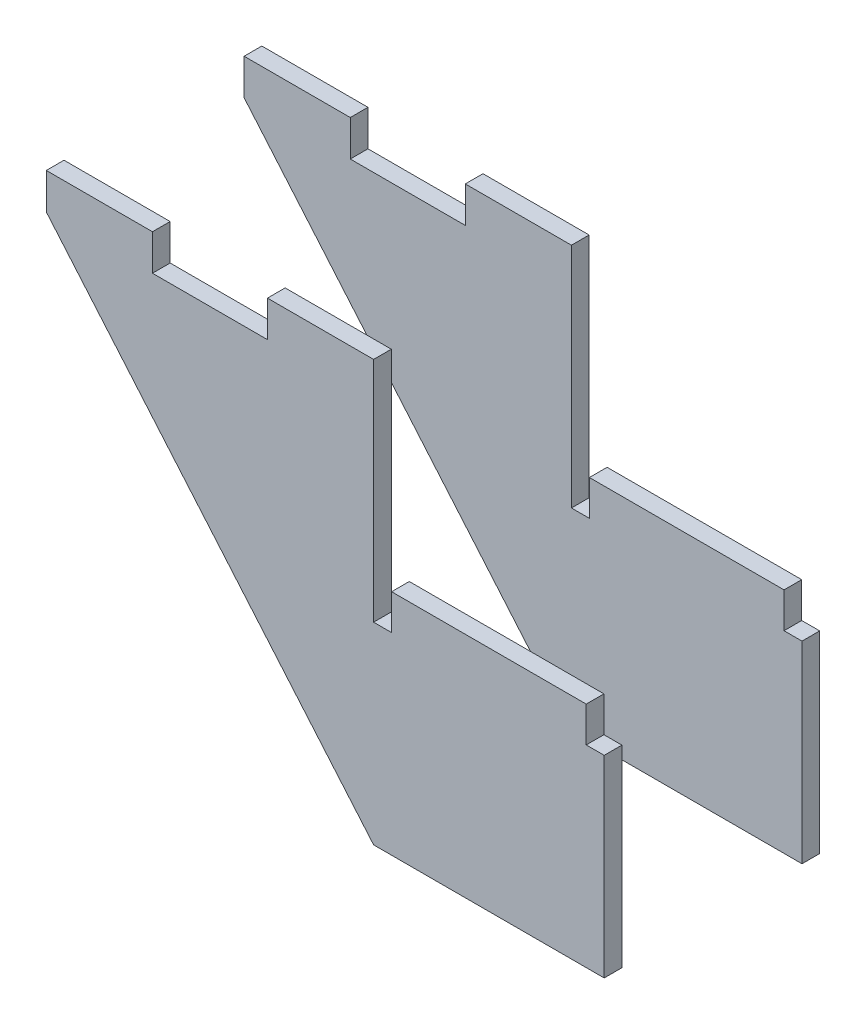
ISO-10303-21;
HEADER;
FILE_DESCRIPTION(('STEP AP214'),'2;1');
FILE_NAME('part.step','',(''),(''),'','','');
FILE_SCHEMA(('AUTOMOTIVE_DESIGN { 1 0 10303 214 1 1 1 1 }'));
ENDSEC;
DATA;
#1=APPLICATION_CONTEXT('core data for automotive mechanical design processes');
#2=APPLICATION_PROTOCOL_DEFINITION('international standard','automotive_design',2000,#1);
#3=PRODUCT_CONTEXT('',#1,'mechanical');
#4=PRODUCT('Part','Part','',(#3));
#5=PRODUCT_RELATED_PRODUCT_CATEGORY('part','',(#4));
#6=PRODUCT_DEFINITION_FORMATION('','',#4);
#7=PRODUCT_DEFINITION_CONTEXT('part definition',#1,'design');
#8=PRODUCT_DEFINITION('design','',#6,#7);
#9=PRODUCT_DEFINITION_SHAPE('','',#8);
#10=(LENGTH_UNIT() NAMED_UNIT(*) SI_UNIT(.MILLI.,.METRE.));
#11=(NAMED_UNIT(*) PLANE_ANGLE_UNIT() SI_UNIT($,.RADIAN.));
#12=(NAMED_UNIT(*) SI_UNIT($,.STERADIAN.) SOLID_ANGLE_UNIT());
#13=UNCERTAINTY_MEASURE_WITH_UNIT(LENGTH_MEASURE(1.E-05),#10,'distance_accuracy_value','');
#14=(GEOMETRIC_REPRESENTATION_CONTEXT(3) GLOBAL_UNCERTAINTY_ASSIGNED_CONTEXT((#13)) GLOBAL_UNIT_ASSIGNED_CONTEXT((#10,
#11,#12)) REPRESENTATION_CONTEXT('',''));
#15=CARTESIAN_POINT('',(0.,0.,0.));
#16=DIRECTION('',(0.,0.,1.));
#17=DIRECTION('',(1.,0.,0.));
#18=AXIS2_PLACEMENT_3D('',#15,#16,#17);
#19=CARTESIAN_POINT('',(-200.,-2270.2189218341,125.085497620243));
#20=DIRECTION('',(1.,0.,0.));
#21=DIRECTION('',(0.,0.,-1.));
#22=AXIS2_PLACEMENT_3D('',#19,#20,#21);
#23=PLANE('',#22);
#24=DIRECTION('',(0.,1.,0.));
#25=VECTOR('',#24,1.);
#26=CARTESIAN_POINT('',(-200.,-2270.2189218341,135.085497620243));
#27=LINE('',#26,#25);
#28=CARTESIAN_POINT('',(-200.,-2161.21892183411,135.085497620243));
#29=VERTEX_POINT('',#28);
#30=CARTESIAN_POINT('',(-200.,-2141.21892183411,135.085497620243));
#31=VERTEX_POINT('',#30);
#32=EDGE_CURVE('E184',#29,#31,#27,.T.);
#33=ORIENTED_EDGE('',*,*,#32,.T.);
#34=DIRECTION('',(0.,0.,1.));
#35=VECTOR('',#34,1.);
#36=CARTESIAN_POINT('',(-200.,-2141.21892183411,125.085497620243));
#37=LINE('',#36,#35);
#38=CARTESIAN_POINT('',(-200.,-2141.21892183411,125.085497620243));
#39=VERTEX_POINT('',#38);
#40=EDGE_CURVE('E12',#39,#31,#37,.T.);
#41=ORIENTED_EDGE('',*,*,#40,.F.);
#42=DIRECTION('',(0.,1.,0.));
#43=VECTOR('',#42,1.);
#44=CARTESIAN_POINT('',(-200.,-2270.2189218341,125.085497620243));
#45=LINE('',#44,#43);
#46=CARTESIAN_POINT('',(-200.,-2161.21892183411,125.085497620243));
#47=VERTEX_POINT('',#46);
#48=EDGE_CURVE('E212',#47,#39,#45,.T.);
#49=ORIENTED_EDGE('',*,*,#48,.F.);
#50=DIRECTION('',(0.,0.,1.));
#51=VECTOR('',#50,1.);
#52=CARTESIAN_POINT('',(-200.,-2161.21892183411,125.085497620243));
#53=LINE('',#52,#51);
#54=EDGE_CURVE('E180',#47,#29,#53,.T.);
#55=ORIENTED_EDGE('',*,*,#54,.T.);
#56=EDGE_LOOP('',(#33,#41,#49,#55));
#57=FACE_BOUND('',#56,.T.);
#58=ADVANCED_FACE('F46',(#57),#23,.F.);
#59=CARTESIAN_POINT('',(-200.,-2141.21892183411,125.085497620243));
#60=DIRECTION('',(0.,-1.,0.));
#61=DIRECTION('',(0.,0.,-1.));
#62=AXIS2_PLACEMENT_3D('',#59,#60,#61);
#63=PLANE('',#62);
#64=DIRECTION('',(1.,0.,0.));
#65=VECTOR('',#64,1.);
#66=CARTESIAN_POINT('',(-200.,-2141.21892183411,135.085497620243));
#67=LINE('',#66,#65);
#68=CARTESIAN_POINT('',(-90.,-2141.21892183411,135.085497620243));
#69=VERTEX_POINT('',#68);
#70=EDGE_CURVE('E187',#31,#69,#67,.T.);
#71=ORIENTED_EDGE('',*,*,#70,.T.);
#72=DIRECTION('',(0.,0.,1.));
#73=VECTOR('',#72,1.);
#74=CARTESIAN_POINT('',(-90.,-2141.21892183411,125.085497620243));
#75=LINE('',#74,#73);
#76=CARTESIAN_POINT('',(-90.,-2141.21892183411,125.085497620243));
#77=VERTEX_POINT('',#76);
#78=EDGE_CURVE('E54',#77,#69,#75,.T.);
#79=ORIENTED_EDGE('',*,*,#78,.F.);
#80=DIRECTION('',(1.,0.,0.));
#81=VECTOR('',#80,1.);
#82=CARTESIAN_POINT('',(-200.,-2141.21892183411,125.085497620243));
#83=LINE('',#82,#81);
#84=EDGE_CURVE('E125',#39,#77,#83,.T.);
#85=ORIENTED_EDGE('',*,*,#84,.F.);
#86=ORIENTED_EDGE('',*,*,#40,.T.);
#87=EDGE_LOOP('',(#71,#79,#85,#86));
#88=FACE_BOUND('',#87,.T.);
#89=ADVANCED_FACE('F305',(#88),#63,.F.);
#90=CARTESIAN_POINT('',(-90.,-2270.2189218341,125.085497620243));
#91=DIRECTION('',(-1.,0.,0.));
#92=DIRECTION('',(0.,0.,1.));
#93=AXIS2_PLACEMENT_3D('',#90,#91,#92);
#94=PLANE('',#93);
#95=DIRECTION('',(0.,-1.,0.));
#96=VECTOR('',#95,1.);
#97=CARTESIAN_POINT('',(-90.,-2270.2189218341,135.085497620243));
#98=LINE('',#97,#96);
#99=CARTESIAN_POINT('',(-90.,-2161.21892183411,135.085497620243));
#100=VERTEX_POINT('',#99);
#101=EDGE_CURVE('E189',#69,#100,#98,.T.);
#102=ORIENTED_EDGE('',*,*,#101,.T.);
#103=DIRECTION('',(0.,0.,1.));
#104=VECTOR('',#103,1.);
#105=CARTESIAN_POINT('',(-90.,-2161.21892183411,125.085497620243));
#106=LINE('',#105,#104);
#107=CARTESIAN_POINT('',(-90.,-2161.21892183411,125.085497620243));
#108=VERTEX_POINT('',#107);
#109=EDGE_CURVE('E240',#108,#100,#106,.T.);
#110=ORIENTED_EDGE('',*,*,#109,.F.);
#111=DIRECTION('',(0.,-1.,0.));
#112=VECTOR('',#111,1.);
#113=CARTESIAN_POINT('',(-90.,-2270.2189218341,125.085497620243));
#114=LINE('',#113,#112);
#115=EDGE_CURVE('E248',#77,#108,#114,.T.);
#116=ORIENTED_EDGE('',*,*,#115,.F.);
#117=ORIENTED_EDGE('',*,*,#78,.T.);
#118=EDGE_LOOP('',(#102,#110,#116,#117));
#119=FACE_BOUND('',#118,.T.);
#120=ADVANCED_FACE('F246',(#119),#94,.F.);
#121=CARTESIAN_POINT('',(-200.000000000005,-2161.21892183411,125.085497620243));
#122=DIRECTION('',(0.,-1.,0.));
#123=DIRECTION('',(1.,0.,0.));
#124=AXIS2_PLACEMENT_3D('',#121,#122,#123);
#125=PLANE('',#124);
#126=DIRECTION('',(1.,0.,0.));
#127=VECTOR('',#126,1.);
#128=CARTESIAN_POINT('',(-200.000000000005,-2161.21892183411,135.085497620243));
#129=LINE('',#128,#127);
#130=CARTESIAN_POINT('',(-79.84,-2161.21892183411,135.085497620243));
#131=VERTEX_POINT('',#130);
#132=EDGE_CURVE('E191',#100,#131,#129,.T.);
#133=ORIENTED_EDGE('',*,*,#132,.T.);
#134=DIRECTION('',(0.,0.,1.));
#135=VECTOR('',#134,1.);
#136=CARTESIAN_POINT('',(-79.84,-2161.21892183411,125.085497620243));
#137=LINE('',#136,#135);
#138=CARTESIAN_POINT('',(-79.84,-2161.21892183411,125.085497620243));
#139=VERTEX_POINT('',#138);
#140=EDGE_CURVE('E237',#139,#131,#137,.T.);
#141=ORIENTED_EDGE('',*,*,#140,.F.);
#142=DIRECTION('',(1.,0.,0.));
#143=VECTOR('',#142,1.);
#144=CARTESIAN_POINT('',(-200.000000000005,-2161.21892183411,125.085497620243));
#145=LINE('',#144,#143);
#146=EDGE_CURVE('E266',#108,#139,#145,.T.);
#147=ORIENTED_EDGE('',*,*,#146,.F.);
#148=ORIENTED_EDGE('',*,*,#109,.T.);
#149=EDGE_LOOP('',(#133,#141,#147,#148));
#150=FACE_BOUND('',#149,.T.);
#151=ADVANCED_FACE('F257',(#150),#125,.F.);
#152=CARTESIAN_POINT('',(-79.84,-2270.2189218341,125.085497620243));
#153=DIRECTION('',(-1.,0.,0.));
#154=DIRECTION('',(0.,0.,1.));
#155=AXIS2_PLACEMENT_3D('',#152,#153,#154);
#156=PLANE('',#155);
#157=DIRECTION('',(0.,-1.,0.));
#158=VECTOR('',#157,1.);
#159=CARTESIAN_POINT('',(-79.84,-2270.2189218341,135.085497620243));
#160=LINE('',#159,#158);
#161=CARTESIAN_POINT('',(-79.84,-2270.21892183411,135.085497620243));
#162=VERTEX_POINT('',#161);
#163=EDGE_CURVE('E193',#131,#162,#160,.T.);
#164=ORIENTED_EDGE('',*,*,#163,.T.);
#165=DIRECTION('',(0.,0.,1.));
#166=VECTOR('',#165,1.);
#167=CARTESIAN_POINT('',(-79.84,-2270.21892183411,125.085497620243));
#168=LINE('',#167,#166);
#169=CARTESIAN_POINT('',(-79.84,-2270.21892183411,125.085497620243));
#170=VERTEX_POINT('',#169);
#171=EDGE_CURVE('E234',#170,#162,#168,.T.);
#172=ORIENTED_EDGE('',*,*,#171,.F.);
#173=DIRECTION('',(0.,-1.,0.));
#174=VECTOR('',#173,1.);
#175=CARTESIAN_POINT('',(-79.84,-2270.2189218341,125.085497620243));
#176=LINE('',#175,#174);
#177=EDGE_CURVE('E263',#139,#170,#176,.T.);
#178=ORIENTED_EDGE('',*,*,#177,.F.);
#179=ORIENTED_EDGE('',*,*,#140,.T.);
#180=EDGE_LOOP('',(#164,#172,#178,#179));
#181=FACE_BOUND('',#180,.T.);
#182=ADVANCED_FACE('F261',(#181),#156,.F.);
#183=CARTESIAN_POINT('',(-200.,-2270.21892183411,125.085497620243));
#184=DIRECTION('',(0.,1.,0.));
#185=DIRECTION('',(0.,0.,1.));
#186=AXIS2_PLACEMENT_3D('',#183,#184,#185);
#187=PLANE('',#186);
#188=DIRECTION('',(-1.,0.,0.));
#189=VECTOR('',#188,1.);
#190=CARTESIAN_POINT('',(-200.,-2270.21892183411,135.085497620243));
#191=LINE('',#190,#189);
#192=CARTESIAN_POINT('',(-210.16,-2270.21892183411,135.085497620243));
#193=VERTEX_POINT('',#192);
#194=EDGE_CURVE('E195',#162,#193,#191,.T.);
#195=ORIENTED_EDGE('',*,*,#194,.T.);
#196=DIRECTION('',(0.,0.,1.));
#197=VECTOR('',#196,1.);
#198=CARTESIAN_POINT('',(-210.16,-2270.21892183411,125.085497620243));
#199=LINE('',#198,#197);
#200=CARTESIAN_POINT('',(-210.16,-2270.21892183411,125.085497620243));
#201=VERTEX_POINT('',#200);
#202=EDGE_CURVE('E231',#201,#193,#199,.T.);
#203=ORIENTED_EDGE('',*,*,#202,.F.);
#204=DIRECTION('',(-1.,0.,0.));
#205=VECTOR('',#204,1.);
#206=CARTESIAN_POINT('',(-200.,-2270.21892183411,125.085497620243));
#207=LINE('',#206,#205);
#208=EDGE_CURVE('E265',#170,#201,#207,.T.);
#209=ORIENTED_EDGE('',*,*,#208,.F.);
#210=ORIENTED_EDGE('',*,*,#171,.T.);
#211=EDGE_LOOP('',(#195,#203,#209,#210));
#212=FACE_BOUND('',#211,.T.);
#213=ADVANCED_FACE('F318',(#212),#187,.F.);
#214=CARTESIAN_POINT('',(-205.890672116999,-2275.23382070833,125.085497620243));
#215=DIRECTION('',(0.761439795845156,0.6482356340894,0.));
#216=DIRECTION('',(-0.6482356340894,0.761439795845156,0.));
#217=AXIS2_PLACEMENT_3D('',#214,#215,#216);
#218=PLANE('',#217);
#219=DIRECTION('',(-0.6482356340894,0.761439795845156,0.));
#220=VECTOR('',#219,1.);
#221=CARTESIAN_POINT('',(-205.890672116999,-2275.23382070833,135.085497620243));
#222=LINE('',#221,#220);
#223=CARTESIAN_POINT('',(-395.16,-2052.91158045471,135.085497620243));
#224=VERTEX_POINT('',#223);
#225=EDGE_CURVE('E197',#193,#224,#222,.T.);
#226=ORIENTED_EDGE('',*,*,#225,.T.);
#227=DIRECTION('',(0.,0.,1.));
#228=VECTOR('',#227,1.);
#229=CARTESIAN_POINT('',(-395.16,-2052.91158045471,125.085497620243));
#230=LINE('',#229,#228);
#231=CARTESIAN_POINT('',(-395.16,-2052.91158045471,125.085497620243));
#232=VERTEX_POINT('',#231);
#233=EDGE_CURVE('E228',#232,#224,#230,.T.);
#234=ORIENTED_EDGE('',*,*,#233,.F.);
#235=DIRECTION('',(-0.6482356340894,0.761439795845156,0.));
#236=VECTOR('',#235,1.);
#237=CARTESIAN_POINT('',(-205.890672116999,-2275.23382070833,125.085497620243));
#238=LINE('',#237,#236);
#239=EDGE_CURVE('E268',#201,#232,#238,.T.);
#240=ORIENTED_EDGE('',*,*,#239,.F.);
#241=ORIENTED_EDGE('',*,*,#202,.T.);
#242=EDGE_LOOP('',(#226,#234,#240,#241));
#243=FACE_BOUND('',#242,.T.);
#244=ADVANCED_FACE('F321',(#243),#218,.F.);
#245=CARTESIAN_POINT('',(-395.16,-2270.2189218341,125.085497620243));
#246=DIRECTION('',(1.,0.,0.));
#247=DIRECTION('',(0.,0.,-1.));
#248=AXIS2_PLACEMENT_3D('',#245,#246,#247);
#249=PLANE('',#248);
#250=DIRECTION('',(0.,1.,0.));
#251=VECTOR('',#250,1.);
#252=CARTESIAN_POINT('',(-395.16,-2270.2189218341,135.085497620243));
#253=LINE('',#252,#251);
#254=CARTESIAN_POINT('',(-395.16,-2032.59158045471,135.085497620243));
#255=VERTEX_POINT('',#254);
#256=EDGE_CURVE('E199',#224,#255,#253,.T.);
#257=ORIENTED_EDGE('',*,*,#256,.T.);
#258=DIRECTION('',(0.,0.,1.));
#259=VECTOR('',#258,1.);
#260=CARTESIAN_POINT('',(-395.16,-2032.59158045471,125.085497620243));
#261=LINE('',#260,#259);
#262=CARTESIAN_POINT('',(-395.16,-2032.59158045471,125.085497620243));
#263=VERTEX_POINT('',#262);
#264=EDGE_CURVE('E225',#263,#255,#261,.T.);
#265=ORIENTED_EDGE('',*,*,#264,.F.);
#266=DIRECTION('',(0.,1.,0.));
#267=VECTOR('',#266,1.);
#268=CARTESIAN_POINT('',(-395.16,-2270.2189218341,125.085497620243));
#269=LINE('',#268,#267);
#270=EDGE_CURVE('E274',#232,#263,#269,.T.);
#271=ORIENTED_EDGE('',*,*,#270,.F.);
#272=ORIENTED_EDGE('',*,*,#233,.T.);
#273=EDGE_LOOP('',(#257,#265,#271,#272));
#274=FACE_BOUND('',#273,.T.);
#275=ADVANCED_FACE('F325',(#274),#249,.F.);
#276=CARTESIAN_POINT('',(-200.,-2032.59158045471,125.085497620243));
#277=DIRECTION('',(0.,-1.,0.));
#278=DIRECTION('',(0.,0.,-1.));
#279=AXIS2_PLACEMENT_3D('',#276,#277,#278);
#280=PLANE('',#279);
#281=DIRECTION('',(1.,0.,0.));
#282=VECTOR('',#281,1.);
#283=CARTESIAN_POINT('',(-200.,-2032.59158045471,135.085497620243));
#284=LINE('',#283,#282);
#285=CARTESIAN_POINT('',(-335.16,-2032.59158045471,135.085497620243));
#286=VERTEX_POINT('',#285);
#287=EDGE_CURVE('E201',#255,#286,#284,.T.);
#288=ORIENTED_EDGE('',*,*,#287,.T.);
#289=DIRECTION('',(0.,0.,1.));
#290=VECTOR('',#289,1.);
#291=CARTESIAN_POINT('',(-335.16,-2032.59158045471,125.085497620243));
#292=LINE('',#291,#290);
#293=CARTESIAN_POINT('',(-335.16,-2032.59158045471,125.085497620243));
#294=VERTEX_POINT('',#293);
#295=EDGE_CURVE('E222',#294,#286,#292,.T.);
#296=ORIENTED_EDGE('',*,*,#295,.F.);
#297=DIRECTION('',(1.,0.,0.));
#298=VECTOR('',#297,1.);
#299=CARTESIAN_POINT('',(-200.,-2032.59158045471,125.085497620243));
#300=LINE('',#299,#298);
#301=EDGE_CURVE('E276',#263,#294,#300,.T.);
#302=ORIENTED_EDGE('',*,*,#301,.F.);
#303=ORIENTED_EDGE('',*,*,#264,.T.);
#304=EDGE_LOOP('',(#288,#296,#302,#303));
#305=FACE_BOUND('',#304,.T.);
#306=ADVANCED_FACE('F329',(#305),#280,.F.);
#307=CARTESIAN_POINT('',(-335.16,-2270.2189218341,125.085497620243));
#308=DIRECTION('',(-1.,0.,0.));
#309=DIRECTION('',(0.,0.,1.));
#310=AXIS2_PLACEMENT_3D('',#307,#308,#309);
#311=PLANE('',#310);
#312=DIRECTION('',(0.,-1.,0.));
#313=VECTOR('',#312,1.);
#314=CARTESIAN_POINT('',(-335.16,-2270.2189218341,135.085497620243));
#315=LINE('',#314,#313);
#316=CARTESIAN_POINT('',(-335.16,-2052.91158045471,135.085497620243));
#317=VERTEX_POINT('',#316);
#318=EDGE_CURVE('E203',#286,#317,#315,.T.);
#319=ORIENTED_EDGE('',*,*,#318,.T.);
#320=DIRECTION('',(0.,0.,1.));
#321=VECTOR('',#320,1.);
#322=CARTESIAN_POINT('',(-335.16,-2052.91158045471,125.085497620243));
#323=LINE('',#322,#321);
#324=CARTESIAN_POINT('',(-335.16,-2052.91158045471,125.085497620243));
#325=VERTEX_POINT('',#324);
#326=EDGE_CURVE('E219',#325,#317,#323,.T.);
#327=ORIENTED_EDGE('',*,*,#326,.F.);
#328=DIRECTION('',(0.,-1.,0.));
#329=VECTOR('',#328,1.);
#330=CARTESIAN_POINT('',(-335.16,-2270.2189218341,125.085497620243));
#331=LINE('',#330,#329);
#332=EDGE_CURVE('E278',#294,#325,#331,.T.);
#333=ORIENTED_EDGE('',*,*,#332,.F.);
#334=ORIENTED_EDGE('',*,*,#295,.T.);
#335=EDGE_LOOP('',(#319,#327,#333,#334));
#336=FACE_BOUND('',#335,.T.);
#337=ADVANCED_FACE('F333',(#336),#311,.F.);
#338=CARTESIAN_POINT('',(-200.,-2052.91158045471,125.085497620243));
#339=DIRECTION('',(0.,-1.,0.));
#340=DIRECTION('',(0.,0.,-1.));
#341=AXIS2_PLACEMENT_3D('',#338,#339,#340);
#342=PLANE('',#341);
#343=DIRECTION('',(1.,0.,0.));
#344=VECTOR('',#343,1.);
#345=CARTESIAN_POINT('',(-200.,-2052.91158045471,135.085497620243));
#346=LINE('',#345,#344);
#347=CARTESIAN_POINT('',(-270.16,-2052.91158045471,135.085497620243));
#348=VERTEX_POINT('',#347);
#349=EDGE_CURVE('E205',#317,#348,#346,.T.);
#350=ORIENTED_EDGE('',*,*,#349,.T.);
#351=DIRECTION('',(0.,0.,1.));
#352=VECTOR('',#351,1.);
#353=CARTESIAN_POINT('',(-270.16,-2052.91158045471,125.085497620243));
#354=LINE('',#353,#352);
#355=CARTESIAN_POINT('',(-270.16,-2052.91158045471,125.085497620243));
#356=VERTEX_POINT('',#355);
#357=EDGE_CURVE('E216',#356,#348,#354,.T.);
#358=ORIENTED_EDGE('',*,*,#357,.F.);
#359=DIRECTION('',(1.,0.,0.));
#360=VECTOR('',#359,1.);
#361=CARTESIAN_POINT('',(-200.,-2052.91158045471,125.085497620243));
#362=LINE('',#361,#360);
#363=EDGE_CURVE('E280',#325,#356,#362,.T.);
#364=ORIENTED_EDGE('',*,*,#363,.F.);
#365=ORIENTED_EDGE('',*,*,#326,.T.);
#366=EDGE_LOOP('',(#350,#358,#364,#365));
#367=FACE_BOUND('',#366,.T.);
#368=ADVANCED_FACE('F286',(#367),#342,.F.);
#369=CARTESIAN_POINT('',(-270.16,-2270.2189218341,125.085497620243));
#370=DIRECTION('',(1.,0.,0.));
#371=DIRECTION('',(0.,0.,-1.));
#372=AXIS2_PLACEMENT_3D('',#369,#370,#371);
#373=PLANE('',#372);
#374=DIRECTION('',(0.,1.,0.));
#375=VECTOR('',#374,1.);
#376=CARTESIAN_POINT('',(-270.16,-2270.2189218341,135.085497620243));
#377=LINE('',#376,#375);
#378=CARTESIAN_POINT('',(-270.16,-2032.59158045471,135.085497620243));
#379=VERTEX_POINT('',#378);
#380=EDGE_CURVE('E207',#348,#379,#377,.T.);
#381=ORIENTED_EDGE('',*,*,#380,.T.);
#382=DIRECTION('',(0.,0.,1.));
#383=VECTOR('',#382,1.);
#384=CARTESIAN_POINT('',(-270.16,-2032.59158045471,125.085497620243));
#385=LINE('',#384,#383);
#386=CARTESIAN_POINT('',(-270.16,-2032.59158045471,125.085497620243));
#387=VERTEX_POINT('',#386);
#388=EDGE_CURVE('E175',#387,#379,#385,.T.);
#389=ORIENTED_EDGE('',*,*,#388,.F.);
#390=DIRECTION('',(0.,1.,0.));
#391=VECTOR('',#390,1.);
#392=CARTESIAN_POINT('',(-270.16,-2270.2189218341,125.085497620243));
#393=LINE('',#392,#391);
#394=EDGE_CURVE('E165',#356,#387,#393,.T.);
#395=ORIENTED_EDGE('',*,*,#394,.F.);
#396=ORIENTED_EDGE('',*,*,#357,.T.);
#397=EDGE_LOOP('',(#381,#389,#395,#396));
#398=FACE_BOUND('',#397,.T.);
#399=ADVANCED_FACE('F290',(#398),#373,.F.);
#400=CARTESIAN_POINT('',(-200.,-2032.59158045471,125.085497620243));
#401=DIRECTION('',(0.,-1.,0.));
#402=DIRECTION('',(0.,0.,-1.));
#403=AXIS2_PLACEMENT_3D('',#400,#401,#402);
#404=PLANE('',#403);
#405=DIRECTION('',(1.,0.,0.));
#406=VECTOR('',#405,1.);
#407=CARTESIAN_POINT('',(-200.,-2032.59158045471,135.085497620243));
#408=LINE('',#407,#406);
#409=CARTESIAN_POINT('',(-210.16,-2032.59158045471,135.085497620243));
#410=VERTEX_POINT('',#409);
#411=EDGE_CURVE('E174',#379,#410,#408,.T.);
#412=ORIENTED_EDGE('',*,*,#411,.T.);
#413=DIRECTION('',(0.,0.,1.));
#414=VECTOR('',#413,1.);
#415=CARTESIAN_POINT('',(-210.16,-2032.59158045471,125.085497620243));
#416=LINE('',#415,#414);
#417=CARTESIAN_POINT('',(-210.16,-2032.59158045471,125.085497620243));
#418=VERTEX_POINT('',#417);
#419=EDGE_CURVE('E171',#418,#410,#416,.T.);
#420=ORIENTED_EDGE('',*,*,#419,.F.);
#421=DIRECTION('',(1.,0.,0.));
#422=VECTOR('',#421,1.);
#423=CARTESIAN_POINT('',(-200.,-2032.59158045471,125.085497620243));
#424=LINE('',#423,#422);
#425=EDGE_CURVE('E159',#387,#418,#424,.T.);
#426=ORIENTED_EDGE('',*,*,#425,.F.);
#427=ORIENTED_EDGE('',*,*,#388,.T.);
#428=EDGE_LOOP('',(#412,#420,#426,#427));
#429=FACE_BOUND('',#428,.T.);
#430=ADVANCED_FACE('F172',(#429),#404,.F.);
#431=CARTESIAN_POINT('',(-210.16,-2270.2189218341,125.085497620243));
#432=DIRECTION('',(-1.,0.,0.));
#433=DIRECTION('',(0.,-1.,0.));
#434=AXIS2_PLACEMENT_3D('',#431,#432,#433);
#435=PLANE('',#434);
#436=DIRECTION('',(0.,-1.,0.));
#437=VECTOR('',#436,1.);
#438=CARTESIAN_POINT('',(-210.16,-2270.2189218341,135.085497620243));
#439=LINE('',#438,#437);
#440=CARTESIAN_POINT('',(-210.16,-2161.21892183411,135.085497620243));
#441=VERTEX_POINT('',#440);
#442=EDGE_CURVE('E111',#410,#441,#439,.T.);
#443=ORIENTED_EDGE('',*,*,#442,.T.);
#444=DIRECTION('',(0.,0.,1.));
#445=VECTOR('',#444,1.);
#446=CARTESIAN_POINT('',(-210.16,-2161.21892183411,125.085497620243));
#447=LINE('',#446,#445);
#448=CARTESIAN_POINT('',(-210.16,-2161.21892183411,125.085497620243));
#449=VERTEX_POINT('',#448);
#450=EDGE_CURVE('E176',#449,#441,#447,.T.);
#451=ORIENTED_EDGE('',*,*,#450,.F.);
#452=DIRECTION('',(0.,-1.,0.));
#453=VECTOR('',#452,1.);
#454=CARTESIAN_POINT('',(-210.16,-2270.2189218341,125.085497620243));
#455=LINE('',#454,#453);
#456=EDGE_CURVE('E163',#418,#449,#455,.T.);
#457=ORIENTED_EDGE('',*,*,#456,.F.);
#458=ORIENTED_EDGE('',*,*,#419,.T.);
#459=EDGE_LOOP('',(#443,#451,#457,#458));
#460=FACE_BOUND('',#459,.T.);
#461=ADVANCED_FACE('F178',(#460),#435,.F.);
#462=CARTESIAN_POINT('',(-199.999999999995,-2161.21892183411,125.085497620243));
#463=DIRECTION('',(0.,-1.,0.));
#464=DIRECTION('',(1.,0.,0.));
#465=AXIS2_PLACEMENT_3D('',#462,#463,#464);
#466=PLANE('',#465);
#467=DIRECTION('',(1.,0.,0.));
#468=VECTOR('',#467,1.);
#469=CARTESIAN_POINT('',(-199.999999999995,-2161.21892183411,135.085497620243));
#470=LINE('',#469,#468);
#471=EDGE_CURVE('E117',#441,#29,#470,.T.);
#472=ORIENTED_EDGE('',*,*,#471,.T.);
#473=ORIENTED_EDGE('',*,*,#54,.F.);
#474=DIRECTION('',(1.,0.,0.));
#475=VECTOR('',#474,1.);
#476=CARTESIAN_POINT('',(-199.999999999995,-2161.21892183411,125.085497620243));
#477=LINE('',#476,#475);
#478=EDGE_CURVE('E62',#449,#47,#477,.T.);
#479=ORIENTED_EDGE('',*,*,#478,.F.);
#480=ORIENTED_EDGE('',*,*,#450,.T.);
#481=EDGE_LOOP('',(#472,#473,#479,#480));
#482=FACE_BOUND('',#481,.T.);
#483=ADVANCED_FACE('F294',(#482),#466,.F.);
#484=CARTESIAN_POINT('',(0.,0.,125.085497620243));
#485=DIRECTION('',(0.,0.,-1.));
#486=DIRECTION('',(0.,1.,0.));
#487=AXIS2_PLACEMENT_3D('',#484,#485,#486);
#488=PLANE('',#487);
#489=ORIENTED_EDGE('',*,*,#48,.T.);
#490=ORIENTED_EDGE('',*,*,#84,.T.);
#491=ORIENTED_EDGE('',*,*,#115,.T.);
#492=ORIENTED_EDGE('',*,*,#146,.T.);
#493=ORIENTED_EDGE('',*,*,#177,.T.);
#494=ORIENTED_EDGE('',*,*,#208,.T.);
#495=ORIENTED_EDGE('',*,*,#239,.T.);
#496=ORIENTED_EDGE('',*,*,#270,.T.);
#497=ORIENTED_EDGE('',*,*,#301,.T.);
#498=ORIENTED_EDGE('',*,*,#332,.T.);
#499=ORIENTED_EDGE('',*,*,#363,.T.);
#500=ORIENTED_EDGE('',*,*,#394,.T.);
#501=ORIENTED_EDGE('',*,*,#425,.T.);
#502=ORIENTED_EDGE('',*,*,#456,.T.);
#503=ORIENTED_EDGE('',*,*,#478,.T.);
#504=EDGE_LOOP('',(#489,#490,#491,#492,#493,#494,#495,#496,#497,#498,#499,#500,#501,#502,#503));
#505=FACE_BOUND('',#504,.T.);
#506=ADVANCED_FACE('F161',(#505),#488,.T.);
#507=CARTESIAN_POINT('',(0.,0.,135.085497620243));
#508=DIRECTION('',(0.,0.,-1.));
#509=DIRECTION('',(0.,1.,0.));
#510=AXIS2_PLACEMENT_3D('',#507,#508,#509);
#511=PLANE('',#510);
#512=ORIENTED_EDGE('',*,*,#32,.F.);
#513=ORIENTED_EDGE('',*,*,#471,.F.);
#514=ORIENTED_EDGE('',*,*,#442,.F.);
#515=ORIENTED_EDGE('',*,*,#411,.F.);
#516=ORIENTED_EDGE('',*,*,#380,.F.);
#517=ORIENTED_EDGE('',*,*,#349,.F.);
#518=ORIENTED_EDGE('',*,*,#318,.F.);
#519=ORIENTED_EDGE('',*,*,#287,.F.);
#520=ORIENTED_EDGE('',*,*,#256,.F.);
#521=ORIENTED_EDGE('',*,*,#225,.F.);
#522=ORIENTED_EDGE('',*,*,#194,.F.);
#523=ORIENTED_EDGE('',*,*,#163,.F.);
#524=ORIENTED_EDGE('',*,*,#132,.F.);
#525=ORIENTED_EDGE('',*,*,#101,.F.);
#526=ORIENTED_EDGE('',*,*,#70,.F.);
#527=EDGE_LOOP('',(#512,#513,#514,#515,#516,#517,#518,#519,#520,#521,#522,#523,#524,#525,#526));
#528=FACE_BOUND('',#527,.T.);
#529=ADVANCED_FACE('F252',(#528),#511,.F.);
#530=CLOSED_SHELL('',(#58,#89,#120,#151,#182,#213,#244,#275,#306,#337,#368,#399,#430,#461,#483,
#506,#529));
#531=MANIFOLD_SOLID_BREP('B2',#530);
#532=CARTESIAN_POINT('',(-210.16,-2161.2189218341,246.89266387771));
#533=DIRECTION('',(-1.,0.,0.));
#534=DIRECTION('',(0.,-1.,0.));
#535=AXIS2_PLACEMENT_3D('',#532,#533,#534);
#536=PLANE('',#535);
#537=DIRECTION('',(0.,1.,0.));
#538=VECTOR('',#537,1.);
#539=CARTESIAN_POINT('',(-210.16,-2161.2189218341,236.89266387771));
#540=LINE('',#539,#538);
#541=CARTESIAN_POINT('',(-210.16,-2161.21892183411,236.89266387771));
#542=VERTEX_POINT('',#541);
#543=CARTESIAN_POINT('',(-210.16,-2032.59158045471,236.89266387771));
#544=VERTEX_POINT('',#543);
#545=EDGE_CURVE('E565',#542,#544,#540,.T.);
#546=ORIENTED_EDGE('',*,*,#545,.T.);
#547=DIRECTION('',(0.,0.,-1.));
#548=VECTOR('',#547,1.);
#549=CARTESIAN_POINT('',(-210.16,-2032.59158045471,246.89266387771));
#550=LINE('',#549,#548);
#551=CARTESIAN_POINT('',(-210.16,-2032.59158045471,246.89266387771));
#552=VERTEX_POINT('',#551);
#553=EDGE_CURVE('E44',#552,#544,#550,.T.);
#554=ORIENTED_EDGE('',*,*,#553,.F.);
#555=DIRECTION('',(0.,1.,0.));
#556=VECTOR('',#555,1.);
#557=CARTESIAN_POINT('',(-210.16,-2161.2189218341,246.89266387771));
#558=LINE('',#557,#556);
#559=CARTESIAN_POINT('',(-210.16,-2161.21892183411,246.89266387771));
#560=VERTEX_POINT('',#559);
#561=EDGE_CURVE('E571',#560,#552,#558,.T.);
#562=ORIENTED_EDGE('',*,*,#561,.F.);
#563=DIRECTION('',(0.,0.,-1.));
#564=VECTOR('',#563,1.);
#565=CARTESIAN_POINT('',(-210.16,-2161.21892183411,246.89266387771));
#566=LINE('',#565,#564);
#567=EDGE_CURVE('E626',#560,#542,#566,.T.);
#568=ORIENTED_EDGE('',*,*,#567,.T.);
#569=EDGE_LOOP('',(#546,#554,#562,#568));
#570=FACE_BOUND('',#569,.T.);
#571=ADVANCED_FACE('F492',(#570),#536,.F.);
#572=CARTESIAN_POINT('',(-200.,-2032.59158045471,246.89266387771));
#573=DIRECTION('',(0.,-1.,0.));
#574=DIRECTION('',(0.,0.,-1.));
#575=AXIS2_PLACEMENT_3D('',#572,#573,#574);
#576=PLANE('',#575);
#577=DIRECTION('',(-1.,0.,0.));
#578=VECTOR('',#577,1.);
#579=CARTESIAN_POINT('',(-200.,-2032.59158045471,236.89266387771));
#580=LINE('',#579,#578);
#581=CARTESIAN_POINT('',(-270.16,-2032.59158045471,236.89266387771));
#582=VERTEX_POINT('',#581);
#583=EDGE_CURVE('E631',#544,#582,#580,.T.);
#584=ORIENTED_EDGE('',*,*,#583,.T.);
#585=DIRECTION('',(0.,0.,-1.));
#586=VECTOR('',#585,1.);
#587=CARTESIAN_POINT('',(-270.16,-2032.59158045471,246.89266387771));
#588=LINE('',#587,#586);
#589=CARTESIAN_POINT('',(-270.16,-2032.59158045471,246.89266387771));
#590=VERTEX_POINT('',#589);
#591=EDGE_CURVE('E500',#590,#582,#588,.T.);
#592=ORIENTED_EDGE('',*,*,#591,.F.);
#593=DIRECTION('',(-1.,0.,0.));
#594=VECTOR('',#593,1.);
#595=CARTESIAN_POINT('',(-200.,-2032.59158045471,246.89266387771));
#596=LINE('',#595,#594);
#597=EDGE_CURVE('E740',#552,#590,#596,.T.);
#598=ORIENTED_EDGE('',*,*,#597,.F.);
#599=ORIENTED_EDGE('',*,*,#553,.T.);
#600=EDGE_LOOP('',(#584,#592,#598,#599));
#601=FACE_BOUND('',#600,.T.);
#602=ADVANCED_FACE('F743',(#601),#576,.F.);
#603=CARTESIAN_POINT('',(-270.16,-2161.2189218341,246.89266387771));
#604=DIRECTION('',(1.,0.,0.));
#605=DIRECTION('',(0.,0.,-1.));
#606=AXIS2_PLACEMENT_3D('',#603,#604,#605);
#607=PLANE('',#606);
#608=DIRECTION('',(0.,-1.,0.));
#609=VECTOR('',#608,1.);
#610=CARTESIAN_POINT('',(-270.16,-2161.2189218341,236.89266387771));
#611=LINE('',#610,#609);
#612=CARTESIAN_POINT('',(-270.16,-2052.91158045471,236.89266387771));
#613=VERTEX_POINT('',#612);
#614=EDGE_CURVE('E633',#582,#613,#611,.T.);
#615=ORIENTED_EDGE('',*,*,#614,.T.);
#616=DIRECTION('',(0.,0.,-1.));
#617=VECTOR('',#616,1.);
#618=CARTESIAN_POINT('',(-270.16,-2052.91158045471,246.89266387771));
#619=LINE('',#618,#617);
#620=CARTESIAN_POINT('',(-270.16,-2052.91158045471,246.89266387771));
#621=VERTEX_POINT('',#620);
#622=EDGE_CURVE('E685',#621,#613,#619,.T.);
#623=ORIENTED_EDGE('',*,*,#622,.F.);
#624=DIRECTION('',(0.,-1.,0.));
#625=VECTOR('',#624,1.);
#626=CARTESIAN_POINT('',(-270.16,-2161.2189218341,246.89266387771));
#627=LINE('',#626,#625);
#628=EDGE_CURVE('E694',#590,#621,#627,.T.);
#629=ORIENTED_EDGE('',*,*,#628,.F.);
#630=ORIENTED_EDGE('',*,*,#591,.T.);
#631=EDGE_LOOP('',(#615,#623,#629,#630));
#632=FACE_BOUND('',#631,.T.);
#633=ADVANCED_FACE('F692',(#632),#607,.F.);
#634=CARTESIAN_POINT('',(-200.,-2052.91158045471,246.89266387771));
#635=DIRECTION('',(0.,-1.,0.));
#636=DIRECTION('',(0.,0.,-1.));
#637=AXIS2_PLACEMENT_3D('',#634,#635,#636);
#638=PLANE('',#637);
#639=DIRECTION('',(-1.,0.,0.));
#640=VECTOR('',#639,1.);
#641=CARTESIAN_POINT('',(-200.,-2052.91158045471,236.89266387771));
#642=LINE('',#641,#640);
#643=CARTESIAN_POINT('',(-335.16,-2052.91158045471,236.89266387771));
#644=VERTEX_POINT('',#643);
#645=EDGE_CURVE('E635',#613,#644,#642,.T.);
#646=ORIENTED_EDGE('',*,*,#645,.T.);
#647=DIRECTION('',(0.,0.,-1.));
#648=VECTOR('',#647,1.);
#649=CARTESIAN_POINT('',(-335.16,-2052.91158045471,246.89266387771));
#650=LINE('',#649,#648);
#651=CARTESIAN_POINT('',(-335.16,-2052.91158045471,246.89266387771));
#652=VERTEX_POINT('',#651);
#653=EDGE_CURVE('E682',#652,#644,#650,.T.);
#654=ORIENTED_EDGE('',*,*,#653,.F.);
#655=DIRECTION('',(-1.,0.,0.));
#656=VECTOR('',#655,1.);
#657=CARTESIAN_POINT('',(-200.,-2052.91158045471,246.89266387771));
#658=LINE('',#657,#656);
#659=EDGE_CURVE('E712',#621,#652,#658,.T.);
#660=ORIENTED_EDGE('',*,*,#659,.F.);
#661=ORIENTED_EDGE('',*,*,#622,.T.);
#662=EDGE_LOOP('',(#646,#654,#660,#661));
#663=FACE_BOUND('',#662,.T.);
#664=ADVANCED_FACE('F703',(#663),#638,.F.);
#665=CARTESIAN_POINT('',(-335.16,-2161.2189218341,246.89266387771));
#666=DIRECTION('',(-1.,0.,0.));
#667=DIRECTION('',(0.,0.,1.));
#668=AXIS2_PLACEMENT_3D('',#665,#666,#667);
#669=PLANE('',#668);
#670=DIRECTION('',(0.,1.,0.));
#671=VECTOR('',#670,1.);
#672=CARTESIAN_POINT('',(-335.16,-2161.2189218341,236.89266387771));
#673=LINE('',#672,#671);
#674=CARTESIAN_POINT('',(-335.16,-2032.59158045471,236.89266387771));
#675=VERTEX_POINT('',#674);
#676=EDGE_CURVE('E637',#644,#675,#673,.T.);
#677=ORIENTED_EDGE('',*,*,#676,.T.);
#678=DIRECTION('',(0.,0.,-1.));
#679=VECTOR('',#678,1.);
#680=CARTESIAN_POINT('',(-335.16,-2032.59158045471,246.89266387771));
#681=LINE('',#680,#679);
#682=CARTESIAN_POINT('',(-335.16,-2032.59158045471,246.89266387771));
#683=VERTEX_POINT('',#682);
#684=EDGE_CURVE('E679',#683,#675,#681,.T.);
#685=ORIENTED_EDGE('',*,*,#684,.F.);
#686=DIRECTION('',(0.,1.,0.));
#687=VECTOR('',#686,1.);
#688=CARTESIAN_POINT('',(-335.16,-2161.2189218341,246.89266387771));
#689=LINE('',#688,#687);
#690=EDGE_CURVE('E709',#652,#683,#689,.T.);
#691=ORIENTED_EDGE('',*,*,#690,.F.);
#692=ORIENTED_EDGE('',*,*,#653,.T.);
#693=EDGE_LOOP('',(#677,#685,#691,#692));
#694=FACE_BOUND('',#693,.T.);
#695=ADVANCED_FACE('F707',(#694),#669,.F.);
#696=CARTESIAN_POINT('',(-200.,-2032.59158045471,246.89266387771));
#697=DIRECTION('',(0.,-1.,0.));
#698=DIRECTION('',(0.,0.,-1.));
#699=AXIS2_PLACEMENT_3D('',#696,#697,#698);
#700=PLANE('',#699);
#701=DIRECTION('',(-1.,0.,0.));
#702=VECTOR('',#701,1.);
#703=CARTESIAN_POINT('',(-200.,-2032.59158045471,236.89266387771));
#704=LINE('',#703,#702);
#705=CARTESIAN_POINT('',(-395.16,-2032.59158045471,236.89266387771));
#706=VERTEX_POINT('',#705);
#707=EDGE_CURVE('E639',#675,#706,#704,.T.);
#708=ORIENTED_EDGE('',*,*,#707,.T.);
#709=DIRECTION('',(0.,0.,-1.));
#710=VECTOR('',#709,1.);
#711=CARTESIAN_POINT('',(-395.16,-2032.59158045471,246.89266387771));
#712=LINE('',#711,#710);
#713=CARTESIAN_POINT('',(-395.16,-2032.59158045471,246.89266387771));
#714=VERTEX_POINT('',#713);
#715=EDGE_CURVE('E676',#714,#706,#712,.T.);
#716=ORIENTED_EDGE('',*,*,#715,.F.);
#717=DIRECTION('',(-1.,0.,0.));
#718=VECTOR('',#717,1.);
#719=CARTESIAN_POINT('',(-200.,-2032.59158045471,246.89266387771));
#720=LINE('',#719,#718);
#721=EDGE_CURVE('E711',#683,#714,#720,.T.);
#722=ORIENTED_EDGE('',*,*,#721,.F.);
#723=ORIENTED_EDGE('',*,*,#684,.T.);
#724=EDGE_LOOP('',(#708,#716,#722,#723));
#725=FACE_BOUND('',#724,.T.);
#726=ADVANCED_FACE('F755',(#725),#700,.F.);
#727=CARTESIAN_POINT('',(-395.16,-2161.2189218341,246.89266387771));
#728=DIRECTION('',(1.,0.,0.));
#729=DIRECTION('',(0.,0.,-1.));
#730=AXIS2_PLACEMENT_3D('',#727,#728,#729);
#731=PLANE('',#730);
#732=DIRECTION('',(0.,-1.,0.));
#733=VECTOR('',#732,1.);
#734=CARTESIAN_POINT('',(-395.16,-2161.2189218341,236.89266387771));
#735=LINE('',#734,#733);
#736=CARTESIAN_POINT('',(-395.16,-2052.91158045471,236.89266387771));
#737=VERTEX_POINT('',#736);
#738=EDGE_CURVE('E641',#706,#737,#735,.T.);
#739=ORIENTED_EDGE('',*,*,#738,.T.);
#740=DIRECTION('',(0.,0.,-1.));
#741=VECTOR('',#740,1.);
#742=CARTESIAN_POINT('',(-395.16,-2052.91158045471,246.89266387771));
#743=LINE('',#742,#741);
#744=CARTESIAN_POINT('',(-395.16,-2052.91158045471,246.89266387771));
#745=VERTEX_POINT('',#744);
#746=EDGE_CURVE('E673',#745,#737,#743,.T.);
#747=ORIENTED_EDGE('',*,*,#746,.F.);
#748=DIRECTION('',(0.,-1.,0.));
#749=VECTOR('',#748,1.);
#750=CARTESIAN_POINT('',(-395.16,-2161.2189218341,246.89266387771));
#751=LINE('',#750,#749);
#752=EDGE_CURVE('E714',#714,#745,#751,.T.);
#753=ORIENTED_EDGE('',*,*,#752,.F.);
#754=ORIENTED_EDGE('',*,*,#715,.T.);
#755=EDGE_LOOP('',(#739,#747,#753,#754));
#756=FACE_BOUND('',#755,.T.);
#757=ADVANCED_FACE('F758',(#756),#731,.F.);
#758=CARTESIAN_POINT('',(-259.692244684984,-2212.03664937439,246.89266387771));
#759=DIRECTION('',(0.761439795845156,0.6482356340894,0.));
#760=DIRECTION('',(-0.6482356340894,0.761439795845156,0.));
#761=AXIS2_PLACEMENT_3D('',#758,#759,#760);
#762=PLANE('',#761);
#763=DIRECTION('',(0.648235634089401,-0.761439795845156,0.));
#764=VECTOR('',#763,1.);
#765=CARTESIAN_POINT('',(-259.692244684984,-2212.03664937439,236.89266387771));
#766=LINE('',#765,#764);
#767=CARTESIAN_POINT('',(-210.16,-2270.21892183411,236.89266387771));
#768=VERTEX_POINT('',#767);
#769=EDGE_CURVE('E643',#737,#768,#766,.T.);
#770=ORIENTED_EDGE('',*,*,#769,.T.);
#771=DIRECTION('',(0.,0.,-1.));
#772=VECTOR('',#771,1.);
#773=CARTESIAN_POINT('',(-210.16,-2270.21892183411,246.89266387771));
#774=LINE('',#773,#772);
#775=CARTESIAN_POINT('',(-210.16,-2270.21892183411,246.89266387771));
#776=VERTEX_POINT('',#775);
#777=EDGE_CURVE('E670',#776,#768,#774,.T.);
#778=ORIENTED_EDGE('',*,*,#777,.F.);
#779=DIRECTION('',(0.648235634089401,-0.761439795845156,0.));
#780=VECTOR('',#779,1.);
#781=CARTESIAN_POINT('',(-259.692244684984,-2212.03664937439,246.89266387771));
#782=LINE('',#781,#780);
#783=EDGE_CURVE('E720',#745,#776,#782,.T.);
#784=ORIENTED_EDGE('',*,*,#783,.F.);
#785=ORIENTED_EDGE('',*,*,#746,.T.);
#786=EDGE_LOOP('',(#770,#778,#784,#785));
#787=FACE_BOUND('',#786,.T.);
#788=ADVANCED_FACE('F762',(#787),#762,.F.);
#789=CARTESIAN_POINT('',(-200.,-2270.21892183411,246.89266387771));
#790=DIRECTION('',(0.,1.,0.));
#791=DIRECTION('',(0.,0.,1.));
#792=AXIS2_PLACEMENT_3D('',#789,#790,#791);
#793=PLANE('',#792);
#794=DIRECTION('',(1.,0.,0.));
#795=VECTOR('',#794,1.);
#796=CARTESIAN_POINT('',(-200.,-2270.21892183411,236.89266387771));
#797=LINE('',#796,#795);
#798=CARTESIAN_POINT('',(-79.84,-2270.21892183411,236.89266387771));
#799=VERTEX_POINT('',#798);
#800=EDGE_CURVE('E645',#768,#799,#797,.T.);
#801=ORIENTED_EDGE('',*,*,#800,.T.);
#802=DIRECTION('',(0.,0.,-1.));
#803=VECTOR('',#802,1.);
#804=CARTESIAN_POINT('',(-79.84,-2270.21892183411,246.89266387771));
#805=LINE('',#804,#803);
#806=CARTESIAN_POINT('',(-79.84,-2270.21892183411,246.89266387771));
#807=VERTEX_POINT('',#806);
#808=EDGE_CURVE('E667',#807,#799,#805,.T.);
#809=ORIENTED_EDGE('',*,*,#808,.F.);
#810=DIRECTION('',(1.,0.,0.));
#811=VECTOR('',#810,1.);
#812=CARTESIAN_POINT('',(-200.,-2270.21892183411,246.89266387771));
#813=LINE('',#812,#811);
#814=EDGE_CURVE('E722',#776,#807,#813,.T.);
#815=ORIENTED_EDGE('',*,*,#814,.F.);
#816=ORIENTED_EDGE('',*,*,#777,.T.);
#817=EDGE_LOOP('',(#801,#809,#815,#816));
#818=FACE_BOUND('',#817,.T.);
#819=ADVANCED_FACE('F766',(#818),#793,.F.);
#820=CARTESIAN_POINT('',(-79.84,-2161.2189218341,246.89266387771));
#821=DIRECTION('',(-1.,0.,0.));
#822=DIRECTION('',(0.,0.,1.));
#823=AXIS2_PLACEMENT_3D('',#820,#821,#822);
#824=PLANE('',#823);
#825=DIRECTION('',(0.,1.,0.));
#826=VECTOR('',#825,1.);
#827=CARTESIAN_POINT('',(-79.84,-2161.2189218341,236.89266387771));
#828=LINE('',#827,#826);
#829=CARTESIAN_POINT('',(-79.84,-2161.21892183411,236.89266387771));
#830=VERTEX_POINT('',#829);
#831=EDGE_CURVE('E647',#799,#830,#828,.T.);
#832=ORIENTED_EDGE('',*,*,#831,.T.);
#833=DIRECTION('',(0.,0.,-1.));
#834=VECTOR('',#833,1.);
#835=CARTESIAN_POINT('',(-79.84,-2161.21892183411,246.89266387771));
#836=LINE('',#835,#834);
#837=CARTESIAN_POINT('',(-79.84,-2161.21892183411,246.89266387771));
#838=VERTEX_POINT('',#837);
#839=EDGE_CURVE('E664',#838,#830,#836,.T.);
#840=ORIENTED_EDGE('',*,*,#839,.F.);
#841=DIRECTION('',(0.,1.,0.));
#842=VECTOR('',#841,1.);
#843=CARTESIAN_POINT('',(-79.84,-2161.2189218341,246.89266387771));
#844=LINE('',#843,#842);
#845=EDGE_CURVE('E724',#807,#838,#844,.T.);
#846=ORIENTED_EDGE('',*,*,#845,.F.);
#847=ORIENTED_EDGE('',*,*,#808,.T.);
#848=EDGE_LOOP('',(#832,#840,#846,#847));
#849=FACE_BOUND('',#848,.T.);
#850=ADVANCED_FACE('F770',(#849),#824,.F.);
#851=CARTESIAN_POINT('',(-200.,-2161.21892183411,246.89266387771));
#852=DIRECTION('',(0.,-1.,0.));
#853=DIRECTION('',(1.,0.,0.));
#854=AXIS2_PLACEMENT_3D('',#851,#852,#853);
#855=PLANE('',#854);
#856=DIRECTION('',(-1.,0.,0.));
#857=VECTOR('',#856,1.);
#858=CARTESIAN_POINT('',(-200.,-2161.21892183411,236.89266387771));
#859=LINE('',#858,#857);
#860=CARTESIAN_POINT('',(-90.,-2161.21892183411,236.89266387771));
#861=VERTEX_POINT('',#860);
#862=EDGE_CURVE('E649',#830,#861,#859,.T.);
#863=ORIENTED_EDGE('',*,*,#862,.T.);
#864=DIRECTION('',(0.,0.,-1.));
#865=VECTOR('',#864,1.);
#866=CARTESIAN_POINT('',(-90.,-2161.21892183411,246.89266387771));
#867=LINE('',#866,#865);
#868=CARTESIAN_POINT('',(-90.,-2161.21892183411,246.89266387771));
#869=VERTEX_POINT('',#868);
#870=EDGE_CURVE('E661',#869,#861,#867,.T.);
#871=ORIENTED_EDGE('',*,*,#870,.F.);
#872=DIRECTION('',(-1.,0.,0.));
#873=VECTOR('',#872,1.);
#874=CARTESIAN_POINT('',(-200.,-2161.21892183411,246.89266387771));
#875=LINE('',#874,#873);
#876=EDGE_CURVE('E726',#838,#869,#875,.T.);
#877=ORIENTED_EDGE('',*,*,#876,.F.);
#878=ORIENTED_EDGE('',*,*,#839,.T.);
#879=EDGE_LOOP('',(#863,#871,#877,#878));
#880=FACE_BOUND('',#879,.T.);
#881=ADVANCED_FACE('F732',(#880),#855,.F.);
#882=CARTESIAN_POINT('',(-90.,-2161.2189218341,246.89266387771));
#883=DIRECTION('',(-1.,0.,0.));
#884=DIRECTION('',(0.,0.,1.));
#885=AXIS2_PLACEMENT_3D('',#882,#883,#884);
#886=PLANE('',#885);
#887=DIRECTION('',(0.,1.,0.));
#888=VECTOR('',#887,1.);
#889=CARTESIAN_POINT('',(-90.,-2161.2189218341,236.89266387771));
#890=LINE('',#889,#888);
#891=CARTESIAN_POINT('',(-90.,-2141.21892183411,236.89266387771));
#892=VERTEX_POINT('',#891);
#893=EDGE_CURVE('E651',#861,#892,#890,.T.);
#894=ORIENTED_EDGE('',*,*,#893,.T.);
#895=DIRECTION('',(0.,0.,-1.));
#896=VECTOR('',#895,1.);
#897=CARTESIAN_POINT('',(-90.,-2141.21892183411,246.89266387771));
#898=LINE('',#897,#896);
#899=CARTESIAN_POINT('',(-90.,-2141.21892183411,246.89266387771));
#900=VERTEX_POINT('',#899);
#901=EDGE_CURVE('E621',#900,#892,#898,.T.);
#902=ORIENTED_EDGE('',*,*,#901,.F.);
#903=DIRECTION('',(0.,1.,0.));
#904=VECTOR('',#903,1.);
#905=CARTESIAN_POINT('',(-90.,-2161.2189218341,246.89266387771));
#906=LINE('',#905,#904);
#907=EDGE_CURVE('E612',#869,#900,#906,.T.);
#908=ORIENTED_EDGE('',*,*,#907,.F.);
#909=ORIENTED_EDGE('',*,*,#870,.T.);
#910=EDGE_LOOP('',(#894,#902,#908,#909));
#911=FACE_BOUND('',#910,.T.);
#912=ADVANCED_FACE('F736',(#911),#886,.F.);
#913=CARTESIAN_POINT('',(-200.,-2141.21892183411,246.89266387771));
#914=DIRECTION('',(0.,-1.,0.));
#915=DIRECTION('',(0.,0.,-1.));
#916=AXIS2_PLACEMENT_3D('',#913,#914,#915);
#917=PLANE('',#916);
#918=DIRECTION('',(-1.,0.,0.));
#919=VECTOR('',#918,1.);
#920=CARTESIAN_POINT('',(-200.,-2141.21892183411,236.89266387771));
#921=LINE('',#920,#919);
#922=CARTESIAN_POINT('',(-200.,-2141.21892183411,236.89266387771));
#923=VERTEX_POINT('',#922);
#924=EDGE_CURVE('E620',#892,#923,#921,.T.);
#925=ORIENTED_EDGE('',*,*,#924,.T.);
#926=DIRECTION('',(0.,0.,-1.));
#927=VECTOR('',#926,1.);
#928=CARTESIAN_POINT('',(-200.,-2141.21892183411,246.89266387771));
#929=LINE('',#928,#927);
#930=CARTESIAN_POINT('',(-200.,-2141.21892183411,246.89266387771));
#931=VERTEX_POINT('',#930);
#932=EDGE_CURVE('E617',#931,#923,#929,.T.);
#933=ORIENTED_EDGE('',*,*,#932,.F.);
#934=DIRECTION('',(-1.,0.,0.));
#935=VECTOR('',#934,1.);
#936=CARTESIAN_POINT('',(-200.,-2141.21892183411,246.89266387771));
#937=LINE('',#936,#935);
#938=EDGE_CURVE('E606',#900,#931,#937,.T.);
#939=ORIENTED_EDGE('',*,*,#938,.F.);
#940=ORIENTED_EDGE('',*,*,#901,.T.);
#941=EDGE_LOOP('',(#925,#933,#939,#940));
#942=FACE_BOUND('',#941,.T.);
#943=ADVANCED_FACE('F618',(#942),#917,.F.);
#944=CARTESIAN_POINT('',(-200.,-2161.2189218341,246.89266387771));
#945=DIRECTION('',(1.,0.,0.));
#946=DIRECTION('',(0.,0.,-1.));
#947=AXIS2_PLACEMENT_3D('',#944,#945,#946);
#948=PLANE('',#947);
#949=DIRECTION('',(0.,-1.,0.));
#950=VECTOR('',#949,1.);
#951=CARTESIAN_POINT('',(-200.,-2161.2189218341,236.89266387771));
#952=LINE('',#951,#950);
#953=CARTESIAN_POINT('',(-200.,-2161.21892183411,236.89266387771));
#954=VERTEX_POINT('',#953);
#955=EDGE_CURVE('E558',#923,#954,#952,.T.);
#956=ORIENTED_EDGE('',*,*,#955,.T.);
#957=DIRECTION('',(0.,0.,-1.));
#958=VECTOR('',#957,1.);
#959=CARTESIAN_POINT('',(-200.,-2161.21892183411,246.89266387771));
#960=LINE('',#959,#958);
#961=CARTESIAN_POINT('',(-200.,-2161.21892183411,246.89266387771));
#962=VERTEX_POINT('',#961);
#963=EDGE_CURVE('E622',#962,#954,#960,.T.);
#964=ORIENTED_EDGE('',*,*,#963,.F.);
#965=DIRECTION('',(0.,-1.,0.));
#966=VECTOR('',#965,1.);
#967=CARTESIAN_POINT('',(-200.,-2161.2189218341,246.89266387771));
#968=LINE('',#967,#966);
#969=EDGE_CURVE('E610',#931,#962,#968,.T.);
#970=ORIENTED_EDGE('',*,*,#969,.F.);
#971=ORIENTED_EDGE('',*,*,#932,.T.);
#972=EDGE_LOOP('',(#956,#964,#970,#971));
#973=FACE_BOUND('',#972,.T.);
#974=ADVANCED_FACE('F624',(#973),#948,.F.);
#975=CARTESIAN_POINT('',(-200.,-2161.21892183411,246.89266387771));
#976=DIRECTION('',(0.,-1.,0.));
#977=DIRECTION('',(1.,0.,0.));
#978=AXIS2_PLACEMENT_3D('',#975,#976,#977);
#979=PLANE('',#978);
#980=DIRECTION('',(-1.,0.,0.));
#981=VECTOR('',#980,1.);
#982=CARTESIAN_POINT('',(-200.,-2161.21892183411,236.89266387771));
#983=LINE('',#982,#981);
#984=EDGE_CURVE('E655',#954,#542,#983,.T.);
#985=ORIENTED_EDGE('',*,*,#984,.T.);
#986=ORIENTED_EDGE('',*,*,#567,.F.);
#987=DIRECTION('',(-1.,0.,0.));
#988=VECTOR('',#987,1.);
#989=CARTESIAN_POINT('',(-200.,-2161.21892183411,246.89266387771));
#990=LINE('',#989,#988);
#991=EDGE_CURVE('E508',#962,#560,#990,.T.);
#992=ORIENTED_EDGE('',*,*,#991,.F.);
#993=ORIENTED_EDGE('',*,*,#963,.T.);
#994=EDGE_LOOP('',(#985,#986,#992,#993));
#995=FACE_BOUND('',#994,.T.);
#996=ADVANCED_FACE('F738',(#995),#979,.F.);
#997=CARTESIAN_POINT('',(0.,0.,246.89266387771));
#998=DIRECTION('',(0.,0.,1.));
#999=DIRECTION('',(0.,-1.,0.));
#1000=AXIS2_PLACEMENT_3D('',#997,#998,#999);
#1001=PLANE('',#1000);
#1002=ORIENTED_EDGE('',*,*,#561,.T.);
#1003=ORIENTED_EDGE('',*,*,#597,.T.);
#1004=ORIENTED_EDGE('',*,*,#628,.T.);
#1005=ORIENTED_EDGE('',*,*,#659,.T.);
#1006=ORIENTED_EDGE('',*,*,#690,.T.);
#1007=ORIENTED_EDGE('',*,*,#721,.T.);
#1008=ORIENTED_EDGE('',*,*,#752,.T.);
#1009=ORIENTED_EDGE('',*,*,#783,.T.);
#1010=ORIENTED_EDGE('',*,*,#814,.T.);
#1011=ORIENTED_EDGE('',*,*,#845,.T.);
#1012=ORIENTED_EDGE('',*,*,#876,.T.);
#1013=ORIENTED_EDGE('',*,*,#907,.T.);
#1014=ORIENTED_EDGE('',*,*,#938,.T.);
#1015=ORIENTED_EDGE('',*,*,#969,.T.);
#1016=ORIENTED_EDGE('',*,*,#991,.T.);
#1017=EDGE_LOOP('',(#1002,#1003,#1004,#1005,#1006,#1007,#1008,#1009,#1010,#1011,#1012,#1013,
#1014,#1015,#1016));
#1018=FACE_BOUND('',#1017,.T.);
#1019=ADVANCED_FACE('F608',(#1018),#1001,.T.);
#1020=CARTESIAN_POINT('',(0.,0.,236.89266387771));
#1021=DIRECTION('',(0.,0.,1.));
#1022=DIRECTION('',(0.,-1.,0.));
#1023=AXIS2_PLACEMENT_3D('',#1020,#1021,#1022);
#1024=PLANE('',#1023);
#1025=ORIENTED_EDGE('',*,*,#545,.F.);
#1026=ORIENTED_EDGE('',*,*,#984,.F.);
#1027=ORIENTED_EDGE('',*,*,#955,.F.);
#1028=ORIENTED_EDGE('',*,*,#924,.F.);
#1029=ORIENTED_EDGE('',*,*,#893,.F.);
#1030=ORIENTED_EDGE('',*,*,#862,.F.);
#1031=ORIENTED_EDGE('',*,*,#831,.F.);
#1032=ORIENTED_EDGE('',*,*,#800,.F.);
#1033=ORIENTED_EDGE('',*,*,#769,.F.);
#1034=ORIENTED_EDGE('',*,*,#738,.F.);
#1035=ORIENTED_EDGE('',*,*,#707,.F.);
#1036=ORIENTED_EDGE('',*,*,#676,.F.);
#1037=ORIENTED_EDGE('',*,*,#645,.F.);
#1038=ORIENTED_EDGE('',*,*,#614,.F.);
#1039=ORIENTED_EDGE('',*,*,#583,.F.);
#1040=EDGE_LOOP('',(#1025,#1026,#1027,#1028,#1029,#1030,#1031,#1032,#1033,#1034,#1035,#1036,
#1037,#1038,#1039));
#1041=FACE_BOUND('',#1040,.T.);
#1042=ADVANCED_FACE('F698',(#1041),#1024,.F.);
#1043=CLOSED_SHELL('',(#571,#602,#633,#664,#695,#726,#757,#788,#819,#850,#881,#912,#943,#974,
#996,#1019,#1042));
#1044=MANIFOLD_SOLID_BREP('B6',#1043);
#1045=ADVANCED_BREP_SHAPE_REPRESENTATION('',(#18,#531,#1044),#14);
#1046=SHAPE_DEFINITION_REPRESENTATION(#9,#1045);
ENDSEC;
END-ISO-10303-21;
